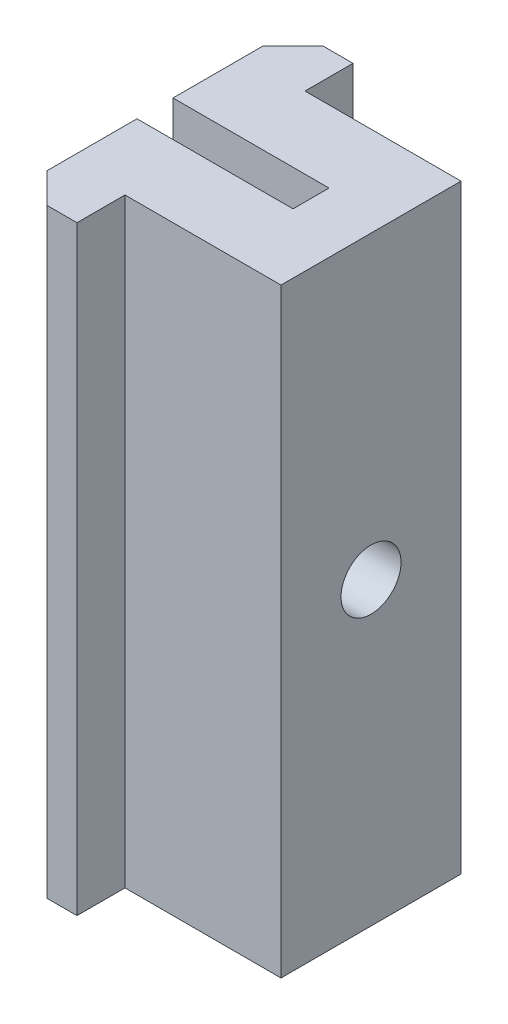
ISO-10303-21;
HEADER;
FILE_DESCRIPTION(('STEP AP214'),'2;1');
FILE_NAME('part.step','',(''),(''),'','','');
FILE_SCHEMA(('AUTOMOTIVE_DESIGN { 1 0 10303 214 1 1 1 1 }'));
ENDSEC;
DATA;
#1=APPLICATION_CONTEXT('core data for automotive mechanical design processes');
#2=APPLICATION_PROTOCOL_DEFINITION('international standard','automotive_design',2000,#1);
#3=PRODUCT_CONTEXT('',#1,'mechanical');
#4=PRODUCT('Part','Part','',(#3));
#5=PRODUCT_RELATED_PRODUCT_CATEGORY('part','',(#4));
#6=PRODUCT_DEFINITION_FORMATION('','',#4);
#7=PRODUCT_DEFINITION_CONTEXT('part definition',#1,'design');
#8=PRODUCT_DEFINITION('design','',#6,#7);
#9=PRODUCT_DEFINITION_SHAPE('','',#8);
#10=(LENGTH_UNIT() NAMED_UNIT(*) SI_UNIT(.MILLI.,.METRE.));
#11=(NAMED_UNIT(*) PLANE_ANGLE_UNIT() SI_UNIT($,.RADIAN.));
#12=(NAMED_UNIT(*) SI_UNIT($,.STERADIAN.) SOLID_ANGLE_UNIT());
#13=UNCERTAINTY_MEASURE_WITH_UNIT(LENGTH_MEASURE(1.E-05),#10,'distance_accuracy_value','');
#14=(GEOMETRIC_REPRESENTATION_CONTEXT(3) GLOBAL_UNCERTAINTY_ASSIGNED_CONTEXT((#13)) GLOBAL_UNIT_ASSIGNED_CONTEXT((#10,
#11,#12)) REPRESENTATION_CONTEXT('',''));
#15=CARTESIAN_POINT('',(0.,0.,0.));
#16=DIRECTION('',(0.,0.,1.));
#17=DIRECTION('',(1.,0.,0.));
#18=AXIS2_PLACEMENT_3D('',#15,#16,#17);
#19=CARTESIAN_POINT('',(-15.,-10.,0.));
#20=DIRECTION('',(1.,0.,0.));
#21=DIRECTION('',(0.,0.,-1.));
#22=AXIS2_PLACEMENT_3D('',#19,#20,#21);
#23=CYLINDRICAL_SURFACE('',#22,1.);
#24=CARTESIAN_POINT('',(-5.,-10.,0.));
#25=DIRECTION('',(1.,0.,0.));
#26=DIRECTION('',(0.,0.,-1.));
#27=AXIS2_PLACEMENT_3D('',#24,#25,#26);
#28=CIRCLE('',#27,1.);
#29=CARTESIAN_POINT('',(-5.,-10.,-1.));
#30=VERTEX_POINT('',#29);
#31=EDGE_CURVE('E483',#30,#30,#28,.T.);
#32=ORIENTED_EDGE('',*,*,#31,.T.);
#33=EDGE_LOOP('',(#32));
#34=FACE_BOUND('',#33,.T.);
#35=DIRECTION('',(1.,0.,0.));
#36=VECTOR('',#35,1.);
#37=CARTESIAN_POINT('',(-15.,-10.8,0.599999999999986));
#38=LINE('',#37,#36);
#39=CARTESIAN_POINT('',(-7.,-10.8,0.599999999999986));
#40=VERTEX_POINT('',#39);
#41=CARTESIAN_POINT('',(-7.2,-10.8,0.599999999999986));
#42=VERTEX_POINT('',#41);
#43=EDGE_CURVE('E460',#40,#42,#38,.F.);
#44=ORIENTED_EDGE('',*,*,#43,.T.);
#45=CARTESIAN_POINT('',(-7.2,-10.,0.));
#46=DIRECTION('',(-1.,0.,0.));
#47=DIRECTION('',(0.,0.,1.));
#48=AXIS2_PLACEMENT_3D('',#45,#46,#47);
#49=CIRCLE('',#48,1.);
#50=CARTESIAN_POINT('',(-7.2,-9.19999999999999,0.599999999999986));
#51=VERTEX_POINT('',#50);
#52=EDGE_CURVE('E70',#42,#51,#49,.T.);
#53=ORIENTED_EDGE('',*,*,#52,.T.);
#54=DIRECTION('',(1.,0.,0.));
#55=VECTOR('',#54,1.);
#56=CARTESIAN_POINT('',(-15.,-9.19999999999999,0.599999999999986));
#57=LINE('',#56,#55);
#58=CARTESIAN_POINT('',(-7.,-9.19999999999999,0.599999999999986));
#59=VERTEX_POINT('',#58);
#60=EDGE_CURVE('E470',#51,#59,#57,.T.);
#61=ORIENTED_EDGE('',*,*,#60,.T.);
#62=CARTESIAN_POINT('',(-7.,-10.,0.));
#63=DIRECTION('',(1.,0.,0.));
#64=DIRECTION('',(0.,0.,-1.));
#65=AXIS2_PLACEMENT_3D('',#62,#63,#64);
#66=CIRCLE('',#65,1.);
#67=CARTESIAN_POINT('',(-7.,-9.19999999999999,-0.599999999999986));
#68=VERTEX_POINT('',#67);
#69=EDGE_CURVE('E469',#68,#59,#66,.T.);
#70=ORIENTED_EDGE('',*,*,#69,.F.);
#71=DIRECTION('',(1.,0.,0.));
#72=VECTOR('',#71,1.);
#73=CARTESIAN_POINT('',(-15.,-9.19999999999999,-0.599999999999986));
#74=LINE('',#73,#72);
#75=CARTESIAN_POINT('',(-7.2,-9.19999999999999,-0.599999999999986));
#76=VERTEX_POINT('',#75);
#77=EDGE_CURVE('E246',#76,#68,#74,.T.);
#78=ORIENTED_EDGE('',*,*,#77,.F.);
#79=CARTESIAN_POINT('',(-7.2,-10.,0.));
#80=DIRECTION('',(-1.,0.,0.));
#81=DIRECTION('',(0.,0.,1.));
#82=AXIS2_PLACEMENT_3D('',#79,#80,#81);
#83=CIRCLE('',#82,1.);
#84=CARTESIAN_POINT('',(-7.2,-10.8,-0.599999999999986));
#85=VERTEX_POINT('',#84);
#86=EDGE_CURVE('E256',#76,#85,#83,.T.);
#87=ORIENTED_EDGE('',*,*,#86,.T.);
#88=DIRECTION('',(1.,0.,0.));
#89=VECTOR('',#88,1.);
#90=CARTESIAN_POINT('',(-15.,-10.8,-0.599999999999986));
#91=LINE('',#90,#89);
#92=CARTESIAN_POINT('',(-7.,-10.8,-0.599999999999986));
#93=VERTEX_POINT('',#92);
#94=EDGE_CURVE('E465',#93,#85,#91,.F.);
#95=ORIENTED_EDGE('',*,*,#94,.F.);
#96=EDGE_CURVE('E463',#40,#93,#66,.T.);
#97=ORIENTED_EDGE('',*,*,#96,.F.);
#98=EDGE_LOOP('',(#44,#53,#61,#70,#78,#87,#95,#97));
#99=FACE_BOUND('',#98,.T.);
#100=ADVANCED_FACE('F42',(#34,#99),#23,.F.);
#101=CARTESIAN_POINT('',(-7.,-10.,0.));
#102=DIRECTION('',(1.,0.,0.));
#103=DIRECTION('',(0.,1.,0.));
#104=AXIS2_PLACEMENT_3D('',#101,#102,#103);
#105=PLANE('',#104);
#106=DIRECTION('',(0.,1.,0.));
#107=VECTOR('',#106,1.);
#108=CARTESIAN_POINT('',(-7.,-5.,-0.599999999999986));
#109=LINE('',#108,#107);
#110=CARTESIAN_POINT('',(-7.,0.,-0.599999999999986));
#111=VERTEX_POINT('',#110);
#112=EDGE_CURVE('E375',#68,#111,#109,.T.);
#113=ORIENTED_EDGE('',*,*,#112,.F.);
#114=ORIENTED_EDGE('',*,*,#69,.T.);
#115=DIRECTION('',(0.,-1.,0.));
#116=VECTOR('',#115,1.);
#117=CARTESIAN_POINT('',(-7.,-5.,0.599999999999986));
#118=LINE('',#117,#116);
#119=CARTESIAN_POINT('',(-7.,0.,0.599999999999986));
#120=VERTEX_POINT('',#119);
#121=EDGE_CURVE('E424',#120,#59,#118,.T.);
#122=ORIENTED_EDGE('',*,*,#121,.F.);
#123=DIRECTION('',(0.,0.,1.));
#124=VECTOR('',#123,1.);
#125=CARTESIAN_POINT('',(-7.,0.,1.5));
#126=LINE('',#125,#124);
#127=EDGE_CURVE('E372',#111,#120,#126,.T.);
#128=ORIENTED_EDGE('',*,*,#127,.F.);
#129=EDGE_LOOP('',(#113,#114,#122,#128));
#130=FACE_BOUND('',#129,.T.);
#131=ADVANCED_FACE('F314',(#130),#105,.F.);
#132=CARTESIAN_POINT('',(-8.,0.,-0.599999999999986));
#133=DIRECTION('',(0.,0.,-1.));
#134=DIRECTION('',(0.,-1.,0.));
#135=AXIS2_PLACEMENT_3D('',#132,#133,#134);
#136=PLANE('',#135);
#137=DIRECTION('',(-1.,0.,0.));
#138=VECTOR('',#137,1.);
#139=CARTESIAN_POINT('',(-8.2,-8.0921215971661,-0.599999999999986));
#140=LINE('',#139,#138);
#141=CARTESIAN_POINT('',(-12.2,-8.0921215971661,-0.599999999999986));
#142=VERTEX_POINT('',#141);
#143=CARTESIAN_POINT('',(-8.2,-8.0921215971661,-0.599999999999986));
#144=VERTEX_POINT('',#143);
#145=EDGE_CURVE('E216',#142,#144,#140,.F.);
#146=ORIENTED_EDGE('',*,*,#145,.T.);
#147=CARTESIAN_POINT('',(-8.2,-8.0921215971661,-0.599999999999986));
#148=CARTESIAN_POINT('',(-8.15706696049873,-8.1371288365451,-0.599999999999986));
#149=CARTESIAN_POINT('',(-8.11420394711278,-8.18220260782865,-0.599999999999986));
#150=CARTESIAN_POINT('',(-8.02865496792468,-8.27251984901321,-0.599999999999986));
#151=CARTESIAN_POINT('',(-7.98596900637365,-8.31776332293976,-0.599999999999986));
#152=CARTESIAN_POINT('',(-7.85826732040632,-8.4537658889863,-0.599999999999986));
#153=CARTESIAN_POINT('',(-7.77357541537929,-8.54483095555947,-0.599999999999986));
#154=CARTESIAN_POINT('',(-7.64761859399995,-8.68245090363792,-0.599999999999986));
#155=CARTESIAN_POINT('',(-7.6058053956689,-8.72850337038549,-0.599999999999986));
#156=CARTESIAN_POINT('',(-7.52268362301838,-8.82105741871948,-0.599999999999986));
#157=CARTESIAN_POINT('',(-7.48137502151615,-8.86755897586946,-0.599999999999986));
#158=CARTESIAN_POINT('',(-7.3994250624854,-8.9611812364888,-0.599999999999986));
#159=CARTESIAN_POINT('',(-7.3587839614622,-9.0083021660002,-0.599999999999986));
#160=CARTESIAN_POINT('',(-7.27853020883229,-9.10342489705334,-0.599999999999986));
#161=CARTESIAN_POINT('',(-7.23891775181693,-9.1514268623735,-0.599999999999986));
#162=CARTESIAN_POINT('',(-7.2,-9.19999999999999,-0.599999999999986));
#163=B_SPLINE_CURVE_WITH_KNOTS('',3,(#147,#148,#149,#150,#151,#152,#153,#154,#155,#156,#157,
#158,#159,#160,#161,#162),.UNSPECIFIED.,.F.,.F.,(4,2,2,2,2,2,2,4),(0.,0.186600817707324,
0.37320609017065,0.746276152792005,0.932881403494125,1.11947655699619,1.30614181190251,
1.4928421252596),.UNSPECIFIED.);
#164=EDGE_CURVE('E56',#144,#76,#163,.T.);
#165=ORIENTED_EDGE('',*,*,#164,.T.);
#166=ORIENTED_EDGE('',*,*,#77,.T.);
#167=ORIENTED_EDGE('',*,*,#112,.T.);
#168=DIRECTION('',(1.,0.,0.));
#169=VECTOR('',#168,1.);
#170=CARTESIAN_POINT('',(-6.5,0.,-0.599999999999986));
#171=LINE('',#170,#169);
#172=CARTESIAN_POINT('',(-12.2,0.,-0.599999999999986));
#173=VERTEX_POINT('',#172);
#174=EDGE_CURVE('E249',#173,#111,#171,.T.);
#175=ORIENTED_EDGE('',*,*,#174,.F.);
#176=DIRECTION('',(0.,-1.,0.));
#177=VECTOR('',#176,1.);
#178=CARTESIAN_POINT('',(-12.2,-20.,-0.599999999999986));
#179=LINE('',#178,#177);
#180=EDGE_CURVE('E237',#173,#142,#179,.T.);
#181=ORIENTED_EDGE('',*,*,#180,.T.);
#182=EDGE_LOOP('',(#146,#165,#166,#167,#175,#181));
#183=FACE_BOUND('',#182,.T.);
#184=ADVANCED_FACE('F288',(#183),#136,.F.);
#185=CARTESIAN_POINT('',(-8.,0.,0.599999999999986));
#186=DIRECTION('',(0.,0.,-1.));
#187=DIRECTION('',(0.,-1.,0.));
#188=AXIS2_PLACEMENT_3D('',#185,#186,#187);
#189=PLANE('',#188);
#190=ORIENTED_EDGE('',*,*,#60,.F.);
#191=CARTESIAN_POINT('',(-7.2,-9.19999999999999,0.599999999999986));
#192=CARTESIAN_POINT('',(-7.23057813657308,-9.16180918725746,0.599999999999986));
#193=CARTESIAN_POINT('',(-7.26160131071932,-9.12398146467315,0.599999999999986));
#194=CARTESIAN_POINT('',(-7.32433726257451,-9.04890949478973,0.599999999999986));
#195=CARTESIAN_POINT('',(-7.35604995136861,-9.0116651733126,0.599999999999986));
#196=CARTESIAN_POINT('',(-7.41996319100769,-8.93761825547591,0.599999999999986));
#197=CARTESIAN_POINT('',(-7.45216359862498,-8.90081553491146,0.599999999999986));
#198=CARTESIAN_POINT('',(-7.51694814905802,-8.82754735225363,0.599999999999986));
#199=CARTESIAN_POINT('',(-7.54953230600582,-8.79108190266953,0.599999999999986));
#200=CARTESIAN_POINT('',(-7.6476952514146,-8.68211439608878,0.599999999999986));
#201=CARTESIAN_POINT('',(-7.71371316846078,-8.61000832233408,0.599999999999986));
#202=CARTESIAN_POINT('',(-7.84649524615241,-8.46648056435122,0.599999999999986));
#203=CARTESIAN_POINT('',(-7.91325945669752,-8.39505892648693,0.599999999999986));
#204=CARTESIAN_POINT('',(-8.01676191640271,-8.28512593234182,0.599999999999986));
#205=CARTESIAN_POINT('',(-8.05332139509781,-8.246446010261,0.599999999999986));
#206=CARTESIAN_POINT('',(-8.12657029385283,-8.16920171993828,0.599999999999986));
#207=CARTESIAN_POINT('',(-8.16325972705339,-8.13063736415474,0.599999999999986));
#208=CARTESIAN_POINT('',(-8.2,-8.0921215971661,0.599999999999986));
#209=B_SPLINE_CURVE_WITH_KNOTS('',3,(#191,#192,#193,#194,#195,#196,#197,#198,#199,#200,#201,
#202,#203,#204,#205,#206,#207,#208),.UNSPECIFIED.,.F.,.F.,(4,2,2,2,2,2,2,2,4),(0.,
0.146761158624489,0.293503502930747,0.440203558464807,0.58690903340705,0.880189208704056,
1.17348911240262,1.33315910022075,1.49284572266369),.UNSPECIFIED.);
#210=CARTESIAN_POINT('',(-8.2,-8.0921215971661,0.599999999999986));
#211=VERTEX_POINT('',#210);
#212=EDGE_CURVE('E215',#51,#211,#209,.T.);
#213=ORIENTED_EDGE('',*,*,#212,.T.);
#214=DIRECTION('',(-1.,0.,0.));
#215=VECTOR('',#214,1.);
#216=CARTESIAN_POINT('',(-8.2,-8.0921215971661,0.599999999999986));
#217=LINE('',#216,#215);
#218=CARTESIAN_POINT('',(-12.2,-8.0921215971661,0.599999999999986));
#219=VERTEX_POINT('',#218);
#220=EDGE_CURVE('E200',#219,#211,#217,.F.);
#221=ORIENTED_EDGE('',*,*,#220,.F.);
#222=DIRECTION('',(0.,-1.,0.));
#223=VECTOR('',#222,1.);
#224=CARTESIAN_POINT('',(-12.2,-20.,0.599999999999986));
#225=LINE('',#224,#223);
#226=CARTESIAN_POINT('',(-12.2,0.,0.599999999999986));
#227=VERTEX_POINT('',#226);
#228=EDGE_CURVE('E213',#227,#219,#225,.T.);
#229=ORIENTED_EDGE('',*,*,#228,.F.);
#230=DIRECTION('',(-1.,0.,0.));
#231=VECTOR('',#230,1.);
#232=CARTESIAN_POINT('',(-6.5,0.,0.599999999999986));
#233=LINE('',#232,#231);
#234=EDGE_CURVE('E413',#120,#227,#233,.T.);
#235=ORIENTED_EDGE('',*,*,#234,.F.);
#236=ORIENTED_EDGE('',*,*,#121,.T.);
#237=EDGE_LOOP('',(#190,#213,#221,#229,#235,#236));
#238=FACE_BOUND('',#237,.T.);
#239=ADVANCED_FACE('F211',(#238),#189,.T.);
#240=CARTESIAN_POINT('',(-7.,-20.,0.599999999999986));
#241=VERTEX_POINT('',#240);
#242=EDGE_CURVE('E384',#40,#241,#118,.T.);
#243=ORIENTED_EDGE('',*,*,#242,.F.);
#244=ORIENTED_EDGE('',*,*,#96,.T.);
#245=CARTESIAN_POINT('',(-7.,-20.,-0.599999999999986));
#246=VERTEX_POINT('',#245);
#247=EDGE_CURVE('E373',#246,#93,#109,.T.);
#248=ORIENTED_EDGE('',*,*,#247,.F.);
#249=DIRECTION('',(0.,0.,-1.));
#250=VECTOR('',#249,1.);
#251=CARTESIAN_POINT('',(-7.,-20.,-1.5));
#252=LINE('',#251,#250);
#253=EDGE_CURVE('E225',#241,#246,#252,.T.);
#254=ORIENTED_EDGE('',*,*,#253,.F.);
#255=EDGE_LOOP('',(#243,#244,#248,#254));
#256=FACE_BOUND('',#255,.T.);
#257=ADVANCED_FACE('F322',(#256),#105,.F.);
#258=CARTESIAN_POINT('',(-5.,0.,3.));
#259=DIRECTION('',(0.,1.,0.));
#260=DIRECTION('',(1.,0.,0.));
#261=AXIS2_PLACEMENT_3D('',#258,#259,#260);
#262=PLANE('',#261);
#263=ORIENTED_EDGE('',*,*,#174,.T.);
#264=ORIENTED_EDGE('',*,*,#127,.T.);
#265=ORIENTED_EDGE('',*,*,#234,.T.);
#266=DIRECTION('',(0.,0.,-1.));
#267=VECTOR('',#266,1.);
#268=CARTESIAN_POINT('',(-12.2,0.,0.599999999999986));
#269=LINE('',#268,#267);
#270=CARTESIAN_POINT('',(-12.2,0.,3.6));
#271=VERTEX_POINT('',#270);
#272=EDGE_CURVE('E221',#271,#227,#269,.T.);
#273=ORIENTED_EDGE('',*,*,#272,.F.);
#274=DIRECTION('',(-0.707106781186548,0.,-0.707106781186547));
#275=VECTOR('',#274,1.);
#276=CARTESIAN_POINT('',(-10.3,0.,5.5));
#277=LINE('',#276,#275);
#278=CARTESIAN_POINT('',(-11.2,0.,4.6));
#279=VERTEX_POINT('',#278);
#280=EDGE_CURVE('E394',#279,#271,#277,.T.);
#281=ORIENTED_EDGE('',*,*,#280,.F.);
#282=DIRECTION('',(-1.,0.,0.));
#283=VECTOR('',#282,1.);
#284=CARTESIAN_POINT('',(-10.2,0.,4.6));
#285=LINE('',#284,#283);
#286=CARTESIAN_POINT('',(-10.2,0.,4.6));
#287=VERTEX_POINT('',#286);
#288=EDGE_CURVE('E401',#287,#279,#285,.T.);
#289=ORIENTED_EDGE('',*,*,#288,.F.);
#290=DIRECTION('',(0.,0.,1.));
#291=VECTOR('',#290,1.);
#292=CARTESIAN_POINT('',(-10.2,0.,0.599999999999986));
#293=LINE('',#292,#291);
#294=CARTESIAN_POINT('',(-10.2,0.,3.));
#295=VERTEX_POINT('',#294);
#296=EDGE_CURVE('E388',#295,#287,#293,.T.);
#297=ORIENTED_EDGE('',*,*,#296,.F.);
#298=DIRECTION('',(-1.,0.,0.));
#299=VECTOR('',#298,1.);
#300=CARTESIAN_POINT('',(-5.,0.,3.));
#301=LINE('',#300,#299);
#302=CARTESIAN_POINT('',(-5.,0.,3.));
#303=VERTEX_POINT('',#302);
#304=EDGE_CURVE('E236',#303,#295,#301,.T.);
#305=ORIENTED_EDGE('',*,*,#304,.F.);
#306=DIRECTION('',(0.,0.,1.));
#307=VECTOR('',#306,1.);
#308=CARTESIAN_POINT('',(-5.,0.,3.));
#309=LINE('',#308,#307);
#310=CARTESIAN_POINT('',(-5.,0.,-3.00000000000004));
#311=VERTEX_POINT('',#310);
#312=EDGE_CURVE('E245',#311,#303,#309,.T.);
#313=ORIENTED_EDGE('',*,*,#312,.F.);
#314=DIRECTION('',(-1.,0.,0.));
#315=VECTOR('',#314,1.);
#316=CARTESIAN_POINT('',(-5.,0.,-3.00000000000004));
#317=LINE('',#316,#315);
#318=CARTESIAN_POINT('',(-10.2,0.,-3.));
#319=VERTEX_POINT('',#318);
#320=EDGE_CURVE('E425',#311,#319,#317,.T.);
#321=ORIENTED_EDGE('',*,*,#320,.T.);
#322=DIRECTION('',(0.,0.,-1.));
#323=VECTOR('',#322,1.);
#324=CARTESIAN_POINT('',(-10.2,0.,-0.599999999999986));
#325=LINE('',#324,#323);
#326=CARTESIAN_POINT('',(-10.2,0.,-4.6));
#327=VERTEX_POINT('',#326);
#328=EDGE_CURVE('E408',#319,#327,#325,.T.);
#329=ORIENTED_EDGE('',*,*,#328,.T.);
#330=DIRECTION('',(-1.,0.,0.));
#331=VECTOR('',#330,1.);
#332=CARTESIAN_POINT('',(-10.2,0.,-4.6));
#333=LINE('',#332,#331);
#334=CARTESIAN_POINT('',(-11.2,0.,-4.6));
#335=VERTEX_POINT('',#334);
#336=EDGE_CURVE('E392',#327,#335,#333,.T.);
#337=ORIENTED_EDGE('',*,*,#336,.T.);
#338=DIRECTION('',(0.707106781186548,0.,-0.707106781186547));
#339=VECTOR('',#338,1.);
#340=CARTESIAN_POINT('',(-11.8,0.,-4.));
#341=LINE('',#340,#339);
#342=CARTESIAN_POINT('',(-12.2,0.,-3.6));
#343=VERTEX_POINT('',#342);
#344=EDGE_CURVE('E393',#343,#335,#341,.T.);
#345=ORIENTED_EDGE('',*,*,#344,.F.);
#346=DIRECTION('',(0.,0.,1.));
#347=VECTOR('',#346,1.);
#348=CARTESIAN_POINT('',(-12.2,0.,-0.599999999999986));
#349=LINE('',#348,#347);
#350=EDGE_CURVE('E390',#343,#173,#349,.T.);
#351=ORIENTED_EDGE('',*,*,#350,.T.);
#352=EDGE_LOOP('',(#263,#264,#265,#273,#281,#289,#297,#305,#313,#321,#329,#337,#345,#351));
#353=FACE_BOUND('',#352,.T.);
#354=ADVANCED_FACE('F454',(#353),#262,.T.);
#355=CARTESIAN_POINT('',(-11.7,-15.,-4.1));
#356=DIRECTION('',(-0.707106781186547,0.,-0.707106781186548));
#357=DIRECTION('',(-0.707106781186548,0.,0.707106781186547));
#358=AXIS2_PLACEMENT_3D('',#355,#356,#357);
#359=PLANE('',#358);
#360=ORIENTED_EDGE('',*,*,#344,.T.);
#361=DIRECTION('',(0.,-1.,0.));
#362=VECTOR('',#361,1.);
#363=CARTESIAN_POINT('',(-11.2,-15.,-4.6));
#364=LINE('',#363,#362);
#365=CARTESIAN_POINT('',(-11.2,-20.,-4.6));
#366=VERTEX_POINT('',#365);
#367=EDGE_CURVE('E414',#335,#366,#364,.T.);
#368=ORIENTED_EDGE('',*,*,#367,.T.);
#369=DIRECTION('',(-0.707106781186548,0.,0.707106781186547));
#370=VECTOR('',#369,1.);
#371=CARTESIAN_POINT('',(-10.3,-20.,-5.5));
#372=LINE('',#371,#370);
#373=CARTESIAN_POINT('',(-12.2,-20.,-3.6));
#374=VERTEX_POINT('',#373);
#375=EDGE_CURVE('E436',#366,#374,#372,.T.);
#376=ORIENTED_EDGE('',*,*,#375,.T.);
#377=DIRECTION('',(0.,1.,0.));
#378=VECTOR('',#377,1.);
#379=CARTESIAN_POINT('',(-12.2,-15.,-3.6));
#380=LINE('',#379,#378);
#381=EDGE_CURVE('E365',#374,#343,#380,.T.);
#382=ORIENTED_EDGE('',*,*,#381,.T.);
#383=EDGE_LOOP('',(#360,#368,#376,#382));
#384=FACE_BOUND('',#383,.T.);
#385=ADVANCED_FACE('F295',(#384),#359,.T.);
#386=CARTESIAN_POINT('',(-12.2,-10.,-2.6));
#387=DIRECTION('',(1.,0.,0.));
#388=DIRECTION('',(0.,1.,0.));
#389=AXIS2_PLACEMENT_3D('',#386,#387,#388);
#390=PLANE('',#389);
#391=CARTESIAN_POINT('',(-12.2,-11.9078784028339,-0.599999999999986));
#392=VERTEX_POINT('',#391);
#393=CARTESIAN_POINT('',(-12.2,-20.,-0.599999999999986));
#394=VERTEX_POINT('',#393);
#395=EDGE_CURVE('E241',#392,#394,#179,.T.);
#396=ORIENTED_EDGE('',*,*,#395,.F.);
#397=CARTESIAN_POINT('',(-12.2,-10.,0.));
#398=DIRECTION('',(-1.,0.,0.));
#399=DIRECTION('',(0.,0.,1.));
#400=AXIS2_PLACEMENT_3D('',#397,#398,#399);
#401=CIRCLE('',#400,2.);
#402=EDGE_CURVE('E207',#142,#392,#401,.T.);
#403=ORIENTED_EDGE('',*,*,#402,.F.);
#404=ORIENTED_EDGE('',*,*,#180,.F.);
#405=ORIENTED_EDGE('',*,*,#350,.F.);
#406=ORIENTED_EDGE('',*,*,#381,.F.);
#407=DIRECTION('',(0.,0.,-1.));
#408=VECTOR('',#407,1.);
#409=CARTESIAN_POINT('',(-12.2,-20.,-4.6));
#410=LINE('',#409,#408);
#411=EDGE_CURVE('E345',#394,#374,#410,.T.);
#412=ORIENTED_EDGE('',*,*,#411,.F.);
#413=EDGE_LOOP('',(#396,#403,#404,#405,#406,#412));
#414=FACE_BOUND('',#413,.T.);
#415=ADVANCED_FACE('F291',(#414),#390,.F.);
#416=CARTESIAN_POINT('',(-10.2,-20.,-4.6));
#417=DIRECTION('',(0.,0.,1.));
#418=DIRECTION('',(1.,0.,0.));
#419=AXIS2_PLACEMENT_3D('',#416,#417,#418);
#420=PLANE('',#419);
#421=ORIENTED_EDGE('',*,*,#367,.F.);
#422=ORIENTED_EDGE('',*,*,#336,.F.);
#423=DIRECTION('',(0.,-1.,0.));
#424=VECTOR('',#423,1.);
#425=CARTESIAN_POINT('',(-10.2,0.,-4.6));
#426=LINE('',#425,#424);
#427=CARTESIAN_POINT('',(-10.2,-20.,-4.6));
#428=VERTEX_POINT('',#427);
#429=EDGE_CURVE('E362',#327,#428,#426,.T.);
#430=ORIENTED_EDGE('',*,*,#429,.T.);
#431=DIRECTION('',(-1.,0.,0.));
#432=VECTOR('',#431,1.);
#433=CARTESIAN_POINT('',(-10.2,-20.,-4.6));
#434=LINE('',#433,#432);
#435=EDGE_CURVE('E240',#428,#366,#434,.T.);
#436=ORIENTED_EDGE('',*,*,#435,.T.);
#437=EDGE_LOOP('',(#421,#422,#430,#436));
#438=FACE_BOUND('',#437,.T.);
#439=ADVANCED_FACE('F268',(#438),#420,.F.);
#440=CARTESIAN_POINT('',(-10.2,-10.,-2.6));
#441=DIRECTION('',(1.,0.,0.));
#442=DIRECTION('',(0.,1.,0.));
#443=AXIS2_PLACEMENT_3D('',#440,#441,#442);
#444=PLANE('',#443);
#445=DIRECTION('',(0.,1.,0.));
#446=VECTOR('',#445,1.);
#447=CARTESIAN_POINT('',(-10.2,-20.,-3.));
#448=LINE('',#447,#446);
#449=CARTESIAN_POINT('',(-10.2,-20.,-3.));
#450=VERTEX_POINT('',#449);
#451=EDGE_CURVE('E232',#450,#319,#448,.T.);
#452=ORIENTED_EDGE('',*,*,#451,.F.);
#453=DIRECTION('',(0.,0.,1.));
#454=VECTOR('',#453,1.);
#455=CARTESIAN_POINT('',(-10.2,-20.,-4.6));
#456=LINE('',#455,#454);
#457=EDGE_CURVE('E355',#428,#450,#456,.T.);
#458=ORIENTED_EDGE('',*,*,#457,.F.);
#459=ORIENTED_EDGE('',*,*,#429,.F.);
#460=ORIENTED_EDGE('',*,*,#328,.F.);
#461=EDGE_LOOP('',(#452,#458,#459,#460));
#462=FACE_BOUND('',#461,.T.);
#463=ADVANCED_FACE('F286',(#462),#444,.T.);
#464=ORIENTED_EDGE('',*,*,#94,.T.);
#465=CARTESIAN_POINT('',(-7.2,-10.8,-0.599999999999986));
#466=CARTESIAN_POINT('',(-7.23057813657308,-10.8381908127425,-0.599999999999986));
#467=CARTESIAN_POINT('',(-7.26160131071932,-10.8760185353268,-0.599999999999986));
#468=CARTESIAN_POINT('',(-7.32433726257451,-10.9510905052103,-0.599999999999986));
#469=CARTESIAN_POINT('',(-7.35604995136861,-10.9883348266874,-0.599999999999986));
#470=CARTESIAN_POINT('',(-7.41996319100769,-11.0623817445241,-0.599999999999986));
#471=CARTESIAN_POINT('',(-7.45216359862498,-11.0991844650885,-0.599999999999986));
#472=CARTESIAN_POINT('',(-7.51694814905802,-11.1724526477464,-0.599999999999986));
#473=CARTESIAN_POINT('',(-7.54953230600582,-11.2089180973305,-0.599999999999986));
#474=CARTESIAN_POINT('',(-7.6476952514146,-11.3178856039112,-0.599999999999986));
#475=CARTESIAN_POINT('',(-7.71371316846078,-11.3899916776659,-0.599999999999986));
#476=CARTESIAN_POINT('',(-7.84649524615241,-11.5335194356488,-0.599999999999986));
#477=CARTESIAN_POINT('',(-7.91325945669752,-11.6049410735131,-0.599999999999986));
#478=CARTESIAN_POINT('',(-8.01676191640271,-11.7148740676582,-0.599999999999986));
#479=CARTESIAN_POINT('',(-8.05332139509781,-11.753553989739,-0.599999999999986));
#480=CARTESIAN_POINT('',(-8.12657029385283,-11.8307982800617,-0.599999999999986));
#481=CARTESIAN_POINT('',(-8.16325972705339,-11.8693626358453,-0.599999999999986));
#482=CARTESIAN_POINT('',(-8.2,-11.9078784028339,-0.599999999999986));
#483=B_SPLINE_CURVE_WITH_KNOTS('',3,(#465,#466,#467,#468,#469,#470,#471,#472,#473,#474,#475,
#476,#477,#478,#479,#480,#481,#482),.UNSPECIFIED.,.F.,.F.,(4,2,2,2,2,2,2,2,4),(0.,
0.146761158624489,0.293503502930747,0.440203558464809,0.58690903340705,0.880189208704054,
1.17348911240262,1.33315910022075,1.49284572266369),.UNSPECIFIED.);
#484=CARTESIAN_POINT('',(-8.2,-11.9078784028339,-0.599999999999986));
#485=VERTEX_POINT('',#484);
#486=EDGE_CURVE('E11',#85,#485,#483,.T.);
#487=ORIENTED_EDGE('',*,*,#486,.T.);
#488=DIRECTION('',(-1.,0.,0.));
#489=VECTOR('',#488,1.);
#490=CARTESIAN_POINT('',(-8.2,-11.9078784028339,-0.599999999999986));
#491=LINE('',#490,#489);
#492=EDGE_CURVE('E217',#485,#392,#491,.T.);
#493=ORIENTED_EDGE('',*,*,#492,.T.);
#494=ORIENTED_EDGE('',*,*,#395,.T.);
#495=DIRECTION('',(-1.,0.,0.));
#496=VECTOR('',#495,1.);
#497=CARTESIAN_POINT('',(-6.5,-20.,-0.599999999999986));
#498=LINE('',#497,#496);
#499=EDGE_CURVE('E343',#246,#394,#498,.T.);
#500=ORIENTED_EDGE('',*,*,#499,.F.);
#501=ORIENTED_EDGE('',*,*,#247,.T.);
#502=EDGE_LOOP('',(#464,#487,#493,#494,#500,#501));
#503=FACE_BOUND('',#502,.T.);
#504=ADVANCED_FACE('F280',(#503),#136,.F.);
#505=CARTESIAN_POINT('',(-11.7,-15.,4.1));
#506=DIRECTION('',(-0.707106781186547,0.,0.707106781186548));
#507=DIRECTION('',(0.,1.,0.));
#508=AXIS2_PLACEMENT_3D('',#505,#506,#507);
#509=PLANE('',#508);
#510=ORIENTED_EDGE('',*,*,#280,.T.);
#511=DIRECTION('',(0.,-1.,0.));
#512=VECTOR('',#511,1.);
#513=CARTESIAN_POINT('',(-12.2,-15.,3.6));
#514=LINE('',#513,#512);
#515=CARTESIAN_POINT('',(-12.2,-20.,3.6));
#516=VERTEX_POINT('',#515);
#517=EDGE_CURVE('E380',#271,#516,#514,.T.);
#518=ORIENTED_EDGE('',*,*,#517,.T.);
#519=DIRECTION('',(0.707106781186548,0.,0.707106781186547));
#520=VECTOR('',#519,1.);
#521=CARTESIAN_POINT('',(-11.8,-20.,4.));
#522=LINE('',#521,#520);
#523=CARTESIAN_POINT('',(-11.2,-20.,4.6));
#524=VERTEX_POINT('',#523);
#525=EDGE_CURVE('E353',#516,#524,#522,.T.);
#526=ORIENTED_EDGE('',*,*,#525,.T.);
#527=DIRECTION('',(0.,1.,0.));
#528=VECTOR('',#527,1.);
#529=CARTESIAN_POINT('',(-11.2,-15.,4.6));
#530=LINE('',#529,#528);
#531=EDGE_CURVE('E350',#524,#279,#530,.T.);
#532=ORIENTED_EDGE('',*,*,#531,.T.);
#533=EDGE_LOOP('',(#510,#518,#526,#532));
#534=FACE_BOUND('',#533,.T.);
#535=ADVANCED_FACE('F285',(#534),#509,.T.);
#536=CARTESIAN_POINT('',(-5.,-20.,-3.));
#537=DIRECTION('',(0.,-1.,0.));
#538=DIRECTION('',(-1.,0.,0.));
#539=AXIS2_PLACEMENT_3D('',#536,#537,#538);
#540=PLANE('',#539);
#541=ORIENTED_EDGE('',*,*,#499,.T.);
#542=ORIENTED_EDGE('',*,*,#411,.T.);
#543=ORIENTED_EDGE('',*,*,#375,.F.);
#544=ORIENTED_EDGE('',*,*,#435,.F.);
#545=ORIENTED_EDGE('',*,*,#457,.T.);
#546=DIRECTION('',(-1.,0.,0.));
#547=VECTOR('',#546,1.);
#548=CARTESIAN_POINT('',(-5.,-20.,-3.));
#549=LINE('',#548,#547);
#550=CARTESIAN_POINT('',(-5.,-20.,-3.));
#551=VERTEX_POINT('',#550);
#552=EDGE_CURVE('E235',#551,#450,#549,.T.);
#553=ORIENTED_EDGE('',*,*,#552,.F.);
#554=DIRECTION('',(0.,0.,-1.));
#555=VECTOR('',#554,1.);
#556=CARTESIAN_POINT('',(-5.,-20.,0.));
#557=LINE('',#556,#555);
#558=CARTESIAN_POINT('',(-5.,-20.,3.));
#559=VERTEX_POINT('',#558);
#560=EDGE_CURVE('E359',#559,#551,#557,.T.);
#561=ORIENTED_EDGE('',*,*,#560,.F.);
#562=DIRECTION('',(-1.,0.,0.));
#563=VECTOR('',#562,1.);
#564=CARTESIAN_POINT('',(-5.,-20.,3.));
#565=LINE('',#564,#563);
#566=CARTESIAN_POINT('',(-10.2,-20.,3.));
#567=VERTEX_POINT('',#566);
#568=EDGE_CURVE('E369',#559,#567,#565,.T.);
#569=ORIENTED_EDGE('',*,*,#568,.T.);
#570=DIRECTION('',(0.,0.,-1.));
#571=VECTOR('',#570,1.);
#572=CARTESIAN_POINT('',(-10.2,-20.,4.6));
#573=LINE('',#572,#571);
#574=CARTESIAN_POINT('',(-10.2,-20.,4.6));
#575=VERTEX_POINT('',#574);
#576=EDGE_CURVE('E389',#575,#567,#573,.T.);
#577=ORIENTED_EDGE('',*,*,#576,.F.);
#578=DIRECTION('',(-1.,0.,0.));
#579=VECTOR('',#578,1.);
#580=CARTESIAN_POINT('',(-10.2,-20.,4.6));
#581=LINE('',#580,#579);
#582=EDGE_CURVE('E366',#575,#524,#581,.T.);
#583=ORIENTED_EDGE('',*,*,#582,.T.);
#584=ORIENTED_EDGE('',*,*,#525,.F.);
#585=DIRECTION('',(0.,0.,1.));
#586=VECTOR('',#585,1.);
#587=CARTESIAN_POINT('',(-12.2,-20.,4.6));
#588=LINE('',#587,#586);
#589=CARTESIAN_POINT('',(-12.2,-20.,0.599999999999986));
#590=VERTEX_POINT('',#589);
#591=EDGE_CURVE('E227',#590,#516,#588,.T.);
#592=ORIENTED_EDGE('',*,*,#591,.F.);
#593=DIRECTION('',(1.,0.,0.));
#594=VECTOR('',#593,1.);
#595=CARTESIAN_POINT('',(-6.5,-20.,0.599999999999986));
#596=LINE('',#595,#594);
#597=EDGE_CURVE('E230',#590,#241,#596,.T.);
#598=ORIENTED_EDGE('',*,*,#597,.T.);
#599=ORIENTED_EDGE('',*,*,#253,.T.);
#600=EDGE_LOOP('',(#541,#542,#543,#544,#545,#553,#561,#569,#577,#583,#584,#592,#598,#599));
#601=FACE_BOUND('',#600,.T.);
#602=ADVANCED_FACE('F327',(#601),#540,.T.);
#603=CARTESIAN_POINT('',(-12.2,-10.,2.6));
#604=DIRECTION('',(-1.,0.,0.));
#605=DIRECTION('',(0.,0.,1.));
#606=AXIS2_PLACEMENT_3D('',#603,#604,#605);
#607=PLANE('',#606);
#608=CARTESIAN_POINT('',(-12.2,-11.9078784028339,0.599999999999986));
#609=VERTEX_POINT('',#608);
#610=EDGE_CURVE('E196',#609,#219,#401,.T.);
#611=ORIENTED_EDGE('',*,*,#610,.F.);
#612=EDGE_CURVE('E223',#609,#590,#225,.T.);
#613=ORIENTED_EDGE('',*,*,#612,.T.);
#614=ORIENTED_EDGE('',*,*,#591,.T.);
#615=ORIENTED_EDGE('',*,*,#517,.F.);
#616=ORIENTED_EDGE('',*,*,#272,.T.);
#617=ORIENTED_EDGE('',*,*,#228,.T.);
#618=EDGE_LOOP('',(#611,#613,#614,#615,#616,#617));
#619=FACE_BOUND('',#618,.T.);
#620=ADVANCED_FACE('F219',(#619),#607,.T.);
#621=CARTESIAN_POINT('',(-10.2,-20.,4.6));
#622=DIRECTION('',(0.,0.,1.));
#623=DIRECTION('',(1.,0.,0.));
#624=AXIS2_PLACEMENT_3D('',#621,#622,#623);
#625=PLANE('',#624);
#626=ORIENTED_EDGE('',*,*,#531,.F.);
#627=ORIENTED_EDGE('',*,*,#582,.F.);
#628=DIRECTION('',(0.,-1.,0.));
#629=VECTOR('',#628,1.);
#630=CARTESIAN_POINT('',(-10.2,0.,4.6));
#631=LINE('',#630,#629);
#632=EDGE_CURVE('E385',#287,#575,#631,.T.);
#633=ORIENTED_EDGE('',*,*,#632,.F.);
#634=ORIENTED_EDGE('',*,*,#288,.T.);
#635=EDGE_LOOP('',(#626,#627,#633,#634));
#636=FACE_BOUND('',#635,.T.);
#637=ADVANCED_FACE('F303',(#636),#625,.T.);
#638=CARTESIAN_POINT('',(-10.2,-10.,2.6));
#639=DIRECTION('',(-1.,0.,0.));
#640=DIRECTION('',(0.,0.,1.));
#641=AXIS2_PLACEMENT_3D('',#638,#639,#640);
#642=PLANE('',#641);
#643=DIRECTION('',(0.,1.,0.));
#644=VECTOR('',#643,1.);
#645=CARTESIAN_POINT('',(-10.2,-20.,3.));
#646=LINE('',#645,#644);
#647=EDGE_CURVE('E415',#567,#295,#646,.T.);
#648=ORIENTED_EDGE('',*,*,#647,.T.);
#649=ORIENTED_EDGE('',*,*,#296,.T.);
#650=ORIENTED_EDGE('',*,*,#632,.T.);
#651=ORIENTED_EDGE('',*,*,#576,.T.);
#652=EDGE_LOOP('',(#648,#649,#650,#651));
#653=FACE_BOUND('',#652,.T.);
#654=ADVANCED_FACE('F301',(#653),#642,.F.);
#655=DIRECTION('',(-1.,0.,0.));
#656=VECTOR('',#655,1.);
#657=CARTESIAN_POINT('',(-8.2,-11.9078784028339,0.599999999999986));
#658=LINE('',#657,#656);
#659=CARTESIAN_POINT('',(-8.2,-11.9078784028339,0.599999999999986));
#660=VERTEX_POINT('',#659);
#661=EDGE_CURVE('E203',#660,#609,#658,.T.);
#662=ORIENTED_EDGE('',*,*,#661,.F.);
#663=CARTESIAN_POINT('',(-8.2,-11.9078784028339,0.599999999999986));
#664=CARTESIAN_POINT('',(-8.15706696049873,-11.8628711634549,0.599999999999986));
#665=CARTESIAN_POINT('',(-8.11420394711278,-11.8177973921713,0.599999999999986));
#666=CARTESIAN_POINT('',(-8.02865496792468,-11.7274801509868,0.599999999999986));
#667=CARTESIAN_POINT('',(-7.98596900637365,-11.6822366770602,0.599999999999986));
#668=CARTESIAN_POINT('',(-7.85826732040632,-11.5462341110137,0.599999999999986));
#669=CARTESIAN_POINT('',(-7.77357541537929,-11.4551690444405,0.599999999999986));
#670=CARTESIAN_POINT('',(-7.64761859399995,-11.3175490963621,0.599999999999986));
#671=CARTESIAN_POINT('',(-7.6058053956689,-11.2714966296145,0.599999999999986));
#672=CARTESIAN_POINT('',(-7.52268362301838,-11.1789425812805,0.599999999999986));
#673=CARTESIAN_POINT('',(-7.48137502151615,-11.1324410241305,0.599999999999986));
#674=CARTESIAN_POINT('',(-7.39942506248539,-11.0388187635112,0.599999999999986));
#675=CARTESIAN_POINT('',(-7.35878396146219,-10.9916978339998,0.599999999999986));
#676=CARTESIAN_POINT('',(-7.27853020883228,-10.8965751029467,0.599999999999986));
#677=CARTESIAN_POINT('',(-7.23891775181693,-10.8485731376265,0.599999999999986));
#678=CARTESIAN_POINT('',(-7.2,-10.8,0.599999999999986));
#679=B_SPLINE_CURVE_WITH_KNOTS('',3,(#663,#664,#665,#666,#667,#668,#669,#670,#671,#672,#673,
#674,#675,#676,#677,#678),.UNSPECIFIED.,.F.,.F.,(4,2,2,2,2,2,2,4),(0.,0.186600817707324,
0.37320609017065,0.746276152792005,0.932881403494128,1.11947655699619,1.30614181190252,
1.4928421252596),.UNSPECIFIED.);
#680=EDGE_CURVE('E248',#660,#42,#679,.T.);
#681=ORIENTED_EDGE('',*,*,#680,.T.);
#682=ORIENTED_EDGE('',*,*,#43,.F.);
#683=ORIENTED_EDGE('',*,*,#242,.T.);
#684=ORIENTED_EDGE('',*,*,#597,.F.);
#685=ORIENTED_EDGE('',*,*,#612,.F.);
#686=EDGE_LOOP('',(#662,#681,#682,#683,#684,#685));
#687=FACE_BOUND('',#686,.T.);
#688=ADVANCED_FACE('F258',(#687),#189,.T.);
#689=CARTESIAN_POINT('',(-5.,0.,-3.00000000000004));
#690=DIRECTION('',(0.,0.,-1.));
#691=DIRECTION('',(0.,-1.,0.));
#692=AXIS2_PLACEMENT_3D('',#689,#690,#691);
#693=PLANE('',#692);
#694=DIRECTION('',(0.,1.,0.));
#695=VECTOR('',#694,1.);
#696=CARTESIAN_POINT('',(-5.,-20.,-3.));
#697=LINE('',#696,#695);
#698=EDGE_CURVE('E361',#551,#311,#697,.T.);
#699=ORIENTED_EDGE('',*,*,#698,.F.);
#700=ORIENTED_EDGE('',*,*,#552,.T.);
#701=ORIENTED_EDGE('',*,*,#451,.T.);
#702=ORIENTED_EDGE('',*,*,#320,.F.);
#703=EDGE_LOOP('',(#699,#700,#701,#702));
#704=FACE_BOUND('',#703,.T.);
#705=ADVANCED_FACE('F289',(#704),#693,.T.);
#706=CARTESIAN_POINT('',(-5.,-20.,3.));
#707=DIRECTION('',(0.,0.,1.));
#708=DIRECTION('',(1.,0.,0.));
#709=AXIS2_PLACEMENT_3D('',#706,#707,#708);
#710=PLANE('',#709);
#711=DIRECTION('',(0.,-1.,0.));
#712=VECTOR('',#711,1.);
#713=CARTESIAN_POINT('',(-5.,-20.,3.));
#714=LINE('',#713,#712);
#715=EDGE_CURVE('E242',#303,#559,#714,.T.);
#716=ORIENTED_EDGE('',*,*,#715,.F.);
#717=ORIENTED_EDGE('',*,*,#304,.T.);
#718=ORIENTED_EDGE('',*,*,#647,.F.);
#719=ORIENTED_EDGE('',*,*,#568,.F.);
#720=EDGE_LOOP('',(#716,#717,#718,#719));
#721=FACE_BOUND('',#720,.T.);
#722=ADVANCED_FACE('F299',(#721),#710,.T.);
#723=CARTESIAN_POINT('',(-5.,-10.,0.));
#724=DIRECTION('',(1.,0.,0.));
#725=DIRECTION('',(0.,1.,0.));
#726=AXIS2_PLACEMENT_3D('',#723,#724,#725);
#727=PLANE('',#726);
#728=ORIENTED_EDGE('',*,*,#31,.F.);
#729=EDGE_LOOP('',(#728));
#730=FACE_BOUND('',#729,.T.);
#731=ORIENTED_EDGE('',*,*,#560,.T.);
#732=ORIENTED_EDGE('',*,*,#698,.T.);
#733=ORIENTED_EDGE('',*,*,#312,.T.);
#734=ORIENTED_EDGE('',*,*,#715,.T.);
#735=EDGE_LOOP('',(#731,#732,#733,#734));
#736=FACE_BOUND('',#735,.T.);
#737=ADVANCED_FACE('F297',(#730,#736),#727,.T.);
#738=CARTESIAN_POINT('',(-8.2,-10.,0.));
#739=DIRECTION('',(-1.,0.,0.));
#740=DIRECTION('',(0.,0.,1.));
#741=AXIS2_PLACEMENT_3D('',#738,#739,#740);
#742=CYLINDRICAL_SURFACE('',#741,2.);
#743=ORIENTED_EDGE('',*,*,#220,.T.);
#744=CARTESIAN_POINT('',(-8.2,-10.,0.));
#745=DIRECTION('',(-1.,0.,0.));
#746=DIRECTION('',(0.,0.,1.));
#747=AXIS2_PLACEMENT_3D('',#744,#745,#746);
#748=CIRCLE('',#747,2.);
#749=EDGE_CURVE('E478',#660,#211,#748,.T.);
#750=ORIENTED_EDGE('',*,*,#749,.F.);
#751=ORIENTED_EDGE('',*,*,#661,.T.);
#752=ORIENTED_EDGE('',*,*,#610,.T.);
#753=EDGE_LOOP('',(#743,#750,#751,#752));
#754=FACE_BOUND('',#753,.T.);
#755=ADVANCED_FACE('F198',(#754),#742,.F.);
#756=ORIENTED_EDGE('',*,*,#402,.T.);
#757=ORIENTED_EDGE('',*,*,#492,.F.);
#758=EDGE_CURVE('E476',#144,#485,#748,.T.);
#759=ORIENTED_EDGE('',*,*,#758,.F.);
#760=ORIENTED_EDGE('',*,*,#145,.F.);
#761=EDGE_LOOP('',(#756,#757,#759,#760));
#762=FACE_BOUND('',#761,.T.);
#763=ADVANCED_FACE('F266',(#762),#742,.F.);
#764=CARTESIAN_POINT('',(-8.2,-10.,0.));
#765=DIRECTION('',(-1.,0.,0.));
#766=DIRECTION('',(0.,0.,1.));
#767=AXIS2_PLACEMENT_3D('',#764,#765,#766);
#768=CONICAL_SURFACE('',#767,2.,0.785398163397447);
#769=ORIENTED_EDGE('',*,*,#212,.F.);
#770=ORIENTED_EDGE('',*,*,#52,.F.);
#771=ORIENTED_EDGE('',*,*,#680,.F.);
#772=ORIENTED_EDGE('',*,*,#749,.T.);
#773=EDGE_LOOP('',(#769,#770,#771,#772));
#774=FACE_BOUND('',#773,.T.);
#775=ADVANCED_FACE('F262',(#774),#768,.F.);
#776=CARTESIAN_POINT('',(-8.2,-10.,0.));
#777=DIRECTION('',(-1.,0.,0.));
#778=DIRECTION('',(0.,0.,1.));
#779=AXIS2_PLACEMENT_3D('',#776,#777,#778);
#780=CONICAL_SURFACE('',#779,2.,0.785398163397447);
#781=ORIENTED_EDGE('',*,*,#486,.F.);
#782=ORIENTED_EDGE('',*,*,#86,.F.);
#783=ORIENTED_EDGE('',*,*,#164,.F.);
#784=ORIENTED_EDGE('',*,*,#758,.T.);
#785=EDGE_LOOP('',(#781,#782,#783,#784));
#786=FACE_BOUND('',#785,.T.);
#787=ADVANCED_FACE('F44',(#786),#780,.F.);
#788=CLOSED_SHELL('',(#100,#131,#184,#239,#257,#354,#385,#415,#439,#463,#504,#535,#602,#620,
#637,#654,#688,#705,#722,#737,#755,#763,#775,#787));
#789=MANIFOLD_SOLID_BREP('B2',#788);
#790=ADVANCED_BREP_SHAPE_REPRESENTATION('',(#18,#789),#14);
#791=SHAPE_DEFINITION_REPRESENTATION(#9,#790);
ENDSEC;
END-ISO-10303-21;
